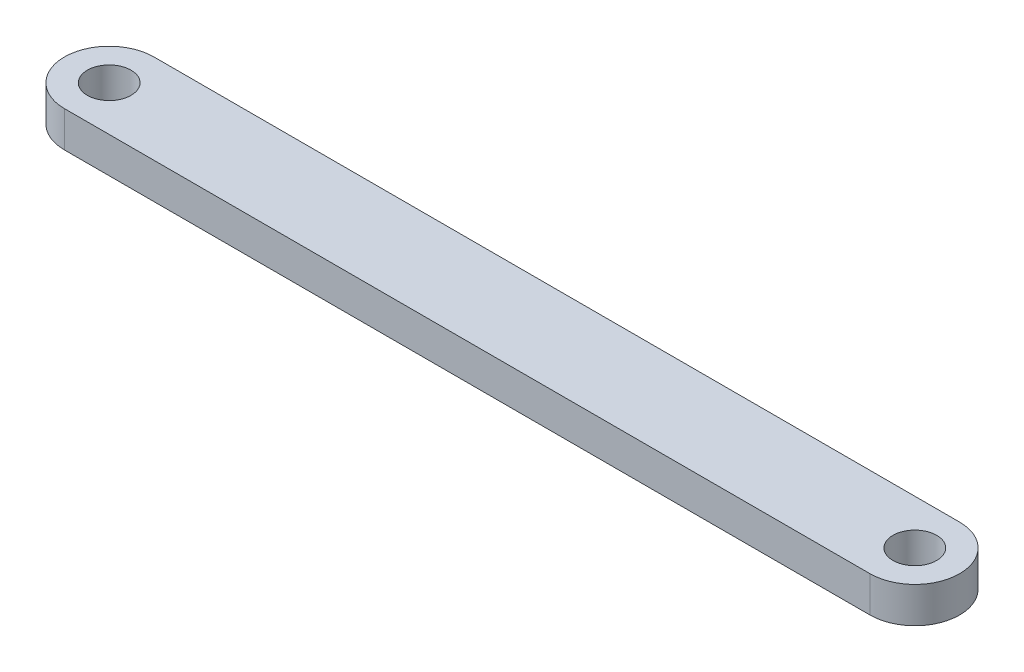
ISO-10303-21;
HEADER;
FILE_DESCRIPTION(('STEP AP214'),'2;1');
FILE_NAME('part.step','',(''),(''),'','','');
FILE_SCHEMA(('AUTOMOTIVE_DESIGN { 1 0 10303 214 1 1 1 1 }'));
ENDSEC;
DATA;
#1=APPLICATION_CONTEXT('core data for automotive mechanical design processes');
#2=APPLICATION_PROTOCOL_DEFINITION('international standard','automotive_design',2000,#1);
#3=PRODUCT_CONTEXT('',#1,'mechanical');
#4=PRODUCT('Part','Part','',(#3));
#5=PRODUCT_RELATED_PRODUCT_CATEGORY('part','',(#4));
#6=PRODUCT_DEFINITION_FORMATION('','',#4);
#7=PRODUCT_DEFINITION_CONTEXT('part definition',#1,'design');
#8=PRODUCT_DEFINITION('design','',#6,#7);
#9=PRODUCT_DEFINITION_SHAPE('','',#8);
#10=(LENGTH_UNIT() NAMED_UNIT(*) SI_UNIT(.MILLI.,.METRE.));
#11=(NAMED_UNIT(*) PLANE_ANGLE_UNIT() SI_UNIT($,.RADIAN.));
#12=(NAMED_UNIT(*) SI_UNIT($,.STERADIAN.) SOLID_ANGLE_UNIT());
#13=UNCERTAINTY_MEASURE_WITH_UNIT(LENGTH_MEASURE(1.E-05),#10,'distance_accuracy_value','');
#14=(GEOMETRIC_REPRESENTATION_CONTEXT(3) GLOBAL_UNCERTAINTY_ASSIGNED_CONTEXT((#13)) GLOBAL_UNIT_ASSIGNED_CONTEXT((#10,
#11,#12)) REPRESENTATION_CONTEXT('',''));
#15=CARTESIAN_POINT('',(0.,0.,0.));
#16=DIRECTION('',(0.,0.,1.));
#17=DIRECTION('',(1.,0.,0.));
#18=AXIS2_PLACEMENT_3D('',#15,#16,#17);
#19=CARTESIAN_POINT('',(0.,2.54,3.16687485875938));
#20=DIRECTION('',(0.,0.,-1.));
#21=DIRECTION('',(-1.,0.,0.));
#22=AXIS2_PLACEMENT_3D('',#19,#20,#21);
#23=PLANE('',#22);
#24=DIRECTION('',(1.,0.,0.));
#25=VECTOR('',#24,1.);
#26=CARTESIAN_POINT('',(0.,0.,3.16687485875938));
#27=LINE('',#26,#25);
#28=CARTESIAN_POINT('',(-3.1144062855563,0.,3.16687485875938));
#29=VERTEX_POINT('',#28);
#30=CARTESIAN_POINT('',(54.0355937144437,0.,3.16687485875938));
#31=VERTEX_POINT('',#30);
#32=EDGE_CURVE('E108',#29,#31,#27,.T.);
#33=ORIENTED_EDGE('',*,*,#32,.T.);
#34=DIRECTION('',(0.,-1.,0.));
#35=VECTOR('',#34,1.);
#36=CARTESIAN_POINT('',(54.0355937144437,2.54,3.16687485875938));
#37=LINE('',#36,#35);
#38=CARTESIAN_POINT('',(54.0355937144437,2.54,3.16687485875938));
#39=VERTEX_POINT('',#38);
#40=EDGE_CURVE('E11',#39,#31,#37,.T.);
#41=ORIENTED_EDGE('',*,*,#40,.F.);
#42=DIRECTION('',(1.,0.,0.));
#43=VECTOR('',#42,1.);
#44=CARTESIAN_POINT('',(0.,2.54,3.16687485875938));
#45=LINE('',#44,#43);
#46=CARTESIAN_POINT('',(-3.1144062855563,2.54,3.16687485875938));
#47=VERTEX_POINT('',#46);
#48=EDGE_CURVE('E87',#47,#39,#45,.T.);
#49=ORIENTED_EDGE('',*,*,#48,.F.);
#50=DIRECTION('',(0.,-1.,0.));
#51=VECTOR('',#50,1.);
#52=CARTESIAN_POINT('',(-3.1144062855563,2.54,3.16687485875938));
#53=LINE('',#52,#51);
#54=EDGE_CURVE('E98',#47,#29,#53,.T.);
#55=ORIENTED_EDGE('',*,*,#54,.T.);
#56=EDGE_LOOP('',(#33,#41,#49,#55));
#57=FACE_BOUND('',#56,.T.);
#58=ADVANCED_FACE('F39',(#57),#23,.F.);
#59=CARTESIAN_POINT('',(54.0355937144437,2.54,-0.00812514124061614));
#60=DIRECTION('',(0.,-1.,0.));
#61=DIRECTION('',(0.,0.,-1.));
#62=AXIS2_PLACEMENT_3D('',#59,#60,#61);
#63=CYLINDRICAL_SURFACE('',#62,3.175);
#64=CARTESIAN_POINT('',(54.0355937144437,0.,-0.00812514124061614));
#65=DIRECTION('',(0.,1.,0.));
#66=DIRECTION('',(0.,0.,1.));
#67=AXIS2_PLACEMENT_3D('',#64,#65,#66);
#68=CIRCLE('',#67,3.175);
#69=CARTESIAN_POINT('',(54.0355937144437,0.,-3.18312514124062));
#70=VERTEX_POINT('',#69);
#71=EDGE_CURVE('E92',#31,#70,#68,.T.);
#72=ORIENTED_EDGE('',*,*,#71,.T.);
#73=DIRECTION('',(0.,-1.,0.));
#74=VECTOR('',#73,1.);
#75=CARTESIAN_POINT('',(54.0355937144437,2.54,-3.18312514124062));
#76=LINE('',#75,#74);
#77=CARTESIAN_POINT('',(54.0355937144437,2.54,-3.18312514124062));
#78=VERTEX_POINT('',#77);
#79=EDGE_CURVE('E48',#78,#70,#76,.T.);
#80=ORIENTED_EDGE('',*,*,#79,.F.);
#81=CARTESIAN_POINT('',(54.0355937144437,2.54,-0.00812514124061614));
#82=DIRECTION('',(0.,1.,0.));
#83=DIRECTION('',(0.,0.,1.));
#84=AXIS2_PLACEMENT_3D('',#81,#82,#83);
#85=CIRCLE('',#84,3.175);
#86=EDGE_CURVE('E82',#39,#78,#85,.T.);
#87=ORIENTED_EDGE('',*,*,#86,.F.);
#88=ORIENTED_EDGE('',*,*,#40,.T.);
#89=EDGE_LOOP('',(#72,#80,#87,#88));
#90=FACE_BOUND('',#89,.T.);
#91=ADVANCED_FACE('F91',(#90),#63,.T.);
#92=CARTESIAN_POINT('',(0.,2.54,-3.18312514124062));
#93=DIRECTION('',(0.,0.,-1.));
#94=DIRECTION('',(-1.,0.,0.));
#95=AXIS2_PLACEMENT_3D('',#92,#93,#94);
#96=PLANE('',#95);
#97=DIRECTION('',(1.,0.,0.));
#98=VECTOR('',#97,1.);
#99=CARTESIAN_POINT('',(0.,0.,-3.18312514124062));
#100=LINE('',#99,#98);
#101=CARTESIAN_POINT('',(-3.1144062855563,0.,-3.18312514124062));
#102=VERTEX_POINT('',#101);
#103=EDGE_CURVE('E112',#102,#70,#100,.T.);
#104=ORIENTED_EDGE('',*,*,#103,.F.);
#105=DIRECTION('',(0.,-1.,0.));
#106=VECTOR('',#105,1.);
#107=CARTESIAN_POINT('',(-3.1144062855563,2.54,-3.18312514124062));
#108=LINE('',#107,#106);
#109=CARTESIAN_POINT('',(-3.1144062855563,2.54,-3.18312514124062));
#110=VERTEX_POINT('',#109);
#111=EDGE_CURVE('E72',#110,#102,#108,.T.);
#112=ORIENTED_EDGE('',*,*,#111,.F.);
#113=DIRECTION('',(1.,0.,0.));
#114=VECTOR('',#113,1.);
#115=CARTESIAN_POINT('',(0.,2.54,-3.18312514124062));
#116=LINE('',#115,#114);
#117=EDGE_CURVE('E85',#110,#78,#116,.T.);
#118=ORIENTED_EDGE('',*,*,#117,.T.);
#119=ORIENTED_EDGE('',*,*,#79,.T.);
#120=EDGE_LOOP('',(#104,#112,#118,#119));
#121=FACE_BOUND('',#120,.T.);
#122=ADVANCED_FACE('F96',(#121),#96,.T.);
#123=CARTESIAN_POINT('',(-3.1144062855563,2.54,-0.00812514124061614));
#124=DIRECTION('',(0.,-1.,0.));
#125=DIRECTION('',(0.,0.,-1.));
#126=AXIS2_PLACEMENT_3D('',#123,#124,#125);
#127=CYLINDRICAL_SURFACE('',#126,1.55);
#128=CARTESIAN_POINT('',(-3.1144062855563,2.54,-0.00812514124061614));
#129=DIRECTION('',(0.,1.,0.));
#130=DIRECTION('',(0.,0.,1.));
#131=AXIS2_PLACEMENT_3D('',#128,#129,#130);
#132=CIRCLE('',#131,1.55);
#133=CARTESIAN_POINT('',(-3.1144062855563,2.54,1.54187485875938));
#134=VERTEX_POINT('',#133);
#135=EDGE_CURVE('E151',#134,#134,#132,.T.);
#136=ORIENTED_EDGE('',*,*,#135,.T.);
#137=EDGE_LOOP('',(#136));
#138=FACE_BOUND('',#137,.T.);
#139=CARTESIAN_POINT('',(-3.1144062855563,0.,-0.00812514124061614));
#140=DIRECTION('',(0.,1.,0.));
#141=DIRECTION('',(0.,0.,1.));
#142=AXIS2_PLACEMENT_3D('',#139,#140,#141);
#143=CIRCLE('',#142,1.55);
#144=CARTESIAN_POINT('',(-3.1144062855563,0.,1.54187485875938));
#145=VERTEX_POINT('',#144);
#146=EDGE_CURVE('E105',#145,#145,#143,.T.);
#147=ORIENTED_EDGE('',*,*,#146,.F.);
#148=EDGE_LOOP('',(#147));
#149=FACE_BOUND('',#148,.T.);
#150=ADVANCED_FACE('F140',(#138,#149),#127,.F.);
#151=CARTESIAN_POINT('',(54.0355937144437,2.54,-0.00812514124061614));
#152=DIRECTION('',(0.,-1.,0.));
#153=DIRECTION('',(0.,0.,-1.));
#154=AXIS2_PLACEMENT_3D('',#151,#152,#153);
#155=CYLINDRICAL_SURFACE('',#154,1.54999999999999);
#156=CARTESIAN_POINT('',(54.0355937144437,2.54,-0.00812514124061614));
#157=DIRECTION('',(0.,1.,0.));
#158=DIRECTION('',(0.,0.,1.));
#159=AXIS2_PLACEMENT_3D('',#156,#157,#158);
#160=CIRCLE('',#159,1.54999999999999);
#161=CARTESIAN_POINT('',(54.0355937144437,2.54,1.54187485875938));
#162=VERTEX_POINT('',#161);
#163=EDGE_CURVE('E115',#162,#162,#160,.F.);
#164=ORIENTED_EDGE('',*,*,#163,.F.);
#165=EDGE_LOOP('',(#164));
#166=FACE_BOUND('',#165,.T.);
#167=CARTESIAN_POINT('',(54.0355937144437,0.,-0.00812514124061614));
#168=DIRECTION('',(0.,1.,0.));
#169=DIRECTION('',(0.,0.,1.));
#170=AXIS2_PLACEMENT_3D('',#167,#168,#169);
#171=CIRCLE('',#170,1.54999999999999);
#172=CARTESIAN_POINT('',(54.0355937144437,0.,1.54187485875938));
#173=VERTEX_POINT('',#172);
#174=EDGE_CURVE('E102',#173,#173,#171,.F.);
#175=ORIENTED_EDGE('',*,*,#174,.T.);
#176=EDGE_LOOP('',(#175));
#177=FACE_BOUND('',#176,.T.);
#178=ADVANCED_FACE('F41',(#166,#177),#155,.F.);
#179=CARTESIAN_POINT('',(-3.1144062855563,2.54,-0.00812514124061614));
#180=DIRECTION('',(0.,-1.,0.));
#181=DIRECTION('',(0.,0.,-1.));
#182=AXIS2_PLACEMENT_3D('',#179,#180,#181);
#183=CYLINDRICAL_SURFACE('',#182,3.175);
#184=CARTESIAN_POINT('',(-3.1144062855563,0.,-0.00812514124061614));
#185=DIRECTION('',(0.,1.,0.));
#186=DIRECTION('',(0.,0.,1.));
#187=AXIS2_PLACEMENT_3D('',#184,#185,#186);
#188=CIRCLE('',#187,3.175);
#189=EDGE_CURVE('E75',#102,#29,#188,.T.);
#190=ORIENTED_EDGE('',*,*,#189,.T.);
#191=ORIENTED_EDGE('',*,*,#54,.F.);
#192=CARTESIAN_POINT('',(-3.1144062855563,2.54,-0.00812514124061614));
#193=DIRECTION('',(0.,1.,0.));
#194=DIRECTION('',(0.,0.,1.));
#195=AXIS2_PLACEMENT_3D('',#192,#193,#194);
#196=CIRCLE('',#195,3.175);
#197=EDGE_CURVE('E56',#110,#47,#196,.T.);
#198=ORIENTED_EDGE('',*,*,#197,.F.);
#199=ORIENTED_EDGE('',*,*,#111,.T.);
#200=EDGE_LOOP('',(#190,#191,#198,#199));
#201=FACE_BOUND('',#200,.T.);
#202=ADVANCED_FACE('F127',(#201),#183,.T.);
#203=CARTESIAN_POINT('',(0.,2.54,0.));
#204=DIRECTION('',(0.,1.,0.));
#205=DIRECTION('',(0.,0.,1.));
#206=AXIS2_PLACEMENT_3D('',#203,#204,#205);
#207=PLANE('',#206);
#208=ORIENTED_EDGE('',*,*,#163,.T.);
#209=EDGE_LOOP('',(#208));
#210=FACE_BOUND('',#209,.T.);
#211=ORIENTED_EDGE('',*,*,#135,.F.);
#212=EDGE_LOOP('',(#211));
#213=FACE_BOUND('',#212,.T.);
#214=ORIENTED_EDGE('',*,*,#48,.T.);
#215=ORIENTED_EDGE('',*,*,#86,.T.);
#216=ORIENTED_EDGE('',*,*,#117,.F.);
#217=ORIENTED_EDGE('',*,*,#197,.T.);
#218=EDGE_LOOP('',(#214,#215,#216,#217));
#219=FACE_BOUND('',#218,.T.);
#220=ADVANCED_FACE('F83',(#210,#213,#219),#207,.T.);
#221=CARTESIAN_POINT('',(0.,0.,0.));
#222=DIRECTION('',(0.,1.,0.));
#223=DIRECTION('',(0.,0.,1.));
#224=AXIS2_PLACEMENT_3D('',#221,#222,#223);
#225=PLANE('',#224);
#226=ORIENTED_EDGE('',*,*,#174,.F.);
#227=EDGE_LOOP('',(#226));
#228=FACE_BOUND('',#227,.T.);
#229=ORIENTED_EDGE('',*,*,#146,.T.);
#230=EDGE_LOOP('',(#229));
#231=FACE_BOUND('',#230,.T.);
#232=ORIENTED_EDGE('',*,*,#32,.F.);
#233=ORIENTED_EDGE('',*,*,#189,.F.);
#234=ORIENTED_EDGE('',*,*,#103,.T.);
#235=ORIENTED_EDGE('',*,*,#71,.F.);
#236=EDGE_LOOP('',(#232,#233,#234,#235));
#237=FACE_BOUND('',#236,.T.);
#238=ADVANCED_FACE('F120',(#228,#231,#237),#225,.F.);
#239=CLOSED_SHELL('',(#58,#91,#122,#150,#178,#202,#220,#238));
#240=MANIFOLD_SOLID_BREP('B2',#239);
#241=ADVANCED_BREP_SHAPE_REPRESENTATION('',(#18,#240),#14);
#242=SHAPE_DEFINITION_REPRESENTATION(#9,#241);
ENDSEC;
END-ISO-10303-21;
